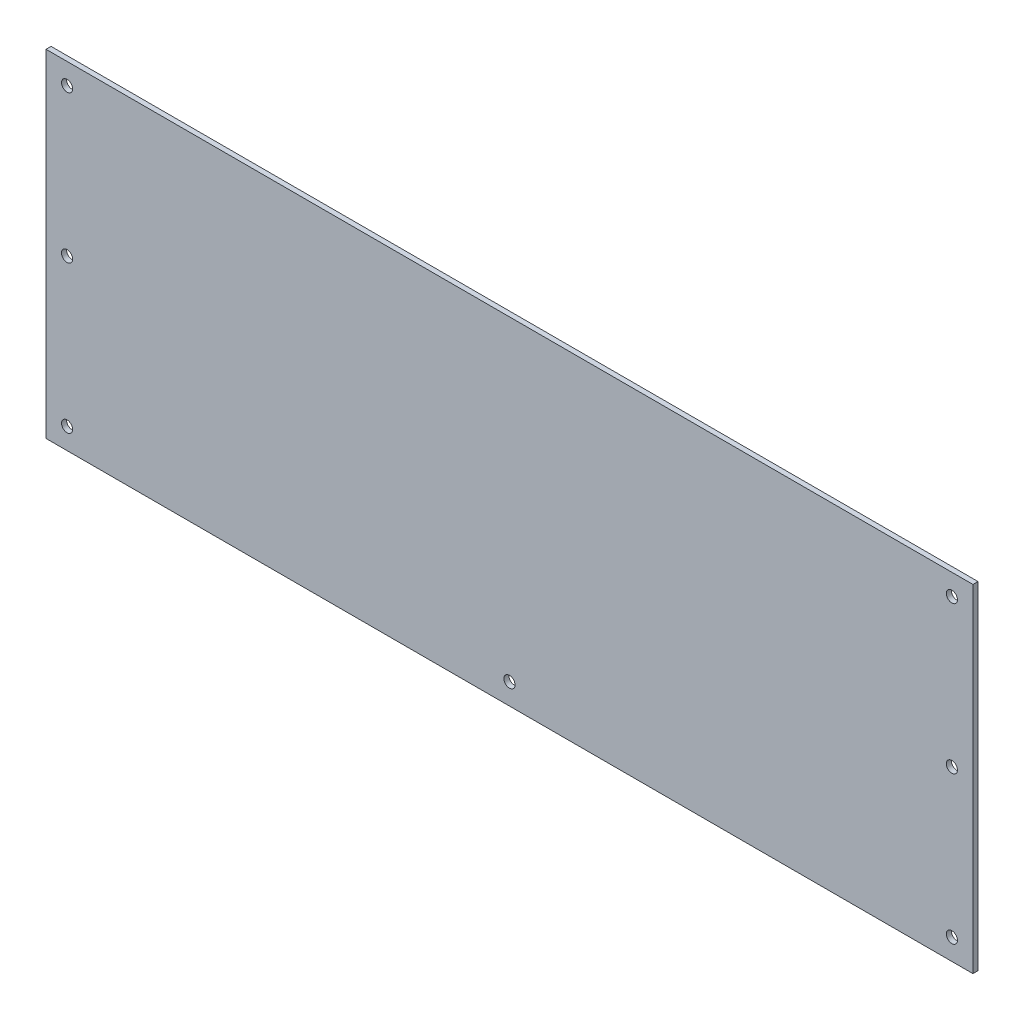
ISO-10303-21;
HEADER;
FILE_DESCRIPTION(('STEP AP214'),'2;1');
FILE_NAME('part.step','',(''),(''),'','','');
FILE_SCHEMA(('AUTOMOTIVE_DESIGN { 1 0 10303 214 1 1 1 1 }'));
ENDSEC;
DATA;
#1=APPLICATION_CONTEXT('core data for automotive mechanical design processes');
#2=APPLICATION_PROTOCOL_DEFINITION('international standard','automotive_design',2000,#1);
#3=PRODUCT_CONTEXT('',#1,'mechanical');
#4=PRODUCT('Part','Part','',(#3));
#5=PRODUCT_RELATED_PRODUCT_CATEGORY('part','',(#4));
#6=PRODUCT_DEFINITION_FORMATION('','',#4);
#7=PRODUCT_DEFINITION_CONTEXT('part definition',#1,'design');
#8=PRODUCT_DEFINITION('design','',#6,#7);
#9=PRODUCT_DEFINITION_SHAPE('','',#8);
#10=(LENGTH_UNIT() NAMED_UNIT(*) SI_UNIT(.MILLI.,.METRE.));
#11=(NAMED_UNIT(*) PLANE_ANGLE_UNIT() SI_UNIT($,.RADIAN.));
#12=(NAMED_UNIT(*) SI_UNIT($,.STERADIAN.) SOLID_ANGLE_UNIT());
#13=UNCERTAINTY_MEASURE_WITH_UNIT(LENGTH_MEASURE(1.E-05),#10,'distance_accuracy_value','');
#14=(GEOMETRIC_REPRESENTATION_CONTEXT(3) GLOBAL_UNCERTAINTY_ASSIGNED_CONTEXT((#13)) GLOBAL_UNIT_ASSIGNED_CONTEXT((#10,
#11,#12)) REPRESENTATION_CONTEXT('',''));
#15=CARTESIAN_POINT('',(0.,0.,0.));
#16=DIRECTION('',(0.,0.,1.));
#17=DIRECTION('',(1.,0.,0.));
#18=AXIS2_PLACEMENT_3D('',#15,#16,#17);
#19=CARTESIAN_POINT('',(0.,0.,0.));
#20=DIRECTION('',(0.,0.,-1.));
#21=DIRECTION('',(-1.,0.,0.));
#22=AXIS2_PLACEMENT_3D('',#19,#20,#21);
#23=PLANE('',#22);
#24=CARTESIAN_POINT('',(12.5,100.,0.));
#25=DIRECTION('',(0.,0.,1.));
#26=DIRECTION('',(1.,0.,0.));
#27=AXIS2_PLACEMENT_3D('',#24,#25,#26);
#28=CIRCLE('',#27,3.3);
#29=CARTESIAN_POINT('',(15.8,100.,0.));
#30=VERTEX_POINT('',#29);
#31=EDGE_CURVE('E145',#30,#30,#28,.T.);
#32=ORIENTED_EDGE('',*,*,#31,.T.);
#33=EDGE_LOOP('',(#32));
#34=FACE_BOUND('',#33,.T.);
#35=CARTESIAN_POINT('',(12.5,187.5,0.));
#36=DIRECTION('',(0.,0.,1.));
#37=DIRECTION('',(1.,0.,0.));
#38=AXIS2_PLACEMENT_3D('',#35,#36,#37);
#39=CIRCLE('',#38,3.3);
#40=CARTESIAN_POINT('',(15.8,187.5,0.));
#41=VERTEX_POINT('',#40);
#42=EDGE_CURVE('E139',#41,#41,#39,.T.);
#43=ORIENTED_EDGE('',*,*,#42,.T.);
#44=EDGE_LOOP('',(#43));
#45=FACE_BOUND('',#44,.T.);
#46=CARTESIAN_POINT('',(12.5,12.5,0.));
#47=DIRECTION('',(0.,0.,1.));
#48=DIRECTION('',(1.,0.,0.));
#49=AXIS2_PLACEMENT_3D('',#46,#47,#48);
#50=CIRCLE('',#49,3.3);
#51=CARTESIAN_POINT('',(15.8,12.5,0.));
#52=VERTEX_POINT('',#51);
#53=EDGE_CURVE('E133',#52,#52,#50,.T.);
#54=ORIENTED_EDGE('',*,*,#53,.T.);
#55=EDGE_LOOP('',(#54));
#56=FACE_BOUND('',#55,.T.);
#57=CARTESIAN_POINT('',(275.000000000004,12.5,0.));
#58=DIRECTION('',(0.,0.,1.));
#59=DIRECTION('',(1.,0.,0.));
#60=AXIS2_PLACEMENT_3D('',#57,#58,#59);
#61=CIRCLE('',#60,3.30000000000003);
#62=CARTESIAN_POINT('',(278.300000000005,12.5,0.));
#63=VERTEX_POINT('',#62);
#64=EDGE_CURVE('E127',#63,#63,#61,.T.);
#65=ORIENTED_EDGE('',*,*,#64,.T.);
#66=EDGE_LOOP('',(#65));
#67=FACE_BOUND('',#66,.T.);
#68=CARTESIAN_POINT('',(537.500000000009,12.5,0.));
#69=DIRECTION('',(0.,0.,1.));
#70=DIRECTION('',(1.,0.,0.));
#71=AXIS2_PLACEMENT_3D('',#68,#69,#70);
#72=CIRCLE('',#71,3.29999999999997);
#73=CARTESIAN_POINT('',(540.800000000009,12.5,0.));
#74=VERTEX_POINT('',#73);
#75=EDGE_CURVE('E121',#74,#74,#72,.T.);
#76=ORIENTED_EDGE('',*,*,#75,.T.);
#77=EDGE_LOOP('',(#76));
#78=FACE_BOUND('',#77,.T.);
#79=DIRECTION('',(0.,-1.,0.));
#80=VECTOR('',#79,1.);
#81=CARTESIAN_POINT('',(0.,0.,0.));
#82=LINE('',#81,#80);
#83=CARTESIAN_POINT('',(0.,200.,0.));
#84=VERTEX_POINT('',#83);
#85=CARTESIAN_POINT('',(0.,0.,0.));
#86=VERTEX_POINT('',#85);
#87=EDGE_CURVE('E96',#84,#86,#82,.T.);
#88=ORIENTED_EDGE('',*,*,#87,.F.);
#89=DIRECTION('',(-1.,0.,0.));
#90=VECTOR('',#89,1.);
#91=CARTESIAN_POINT('',(0.,200.,0.));
#92=LINE('',#91,#90);
#93=CARTESIAN_POINT('',(550.000000000009,200.,0.));
#94=VERTEX_POINT('',#93);
#95=EDGE_CURVE('E72',#94,#84,#92,.T.);
#96=ORIENTED_EDGE('',*,*,#95,.F.);
#97=DIRECTION('',(0.,1.,0.));
#98=VECTOR('',#97,1.);
#99=CARTESIAN_POINT('',(550.000000000009,0.,0.));
#100=LINE('',#99,#98);
#101=CARTESIAN_POINT('',(550.000000000009,0.,0.));
#102=VERTEX_POINT('',#101);
#103=EDGE_CURVE('E66',#102,#94,#100,.T.);
#104=ORIENTED_EDGE('',*,*,#103,.F.);
#105=DIRECTION('',(1.,0.,0.));
#106=VECTOR('',#105,1.);
#107=CARTESIAN_POINT('',(0.,0.,0.));
#108=LINE('',#107,#106);
#109=EDGE_CURVE('E88',#86,#102,#108,.T.);
#110=ORIENTED_EDGE('',*,*,#109,.F.);
#111=EDGE_LOOP('',(#88,#96,#104,#110));
#112=FACE_BOUND('',#111,.T.);
#113=CARTESIAN_POINT('',(537.500000000009,187.5,0.));
#114=DIRECTION('',(0.,0.,1.));
#115=DIRECTION('',(1.,0.,0.));
#116=AXIS2_PLACEMENT_3D('',#113,#114,#115);
#117=CIRCLE('',#116,3.29999999999997);
#118=CARTESIAN_POINT('',(540.800000000009,187.5,0.));
#119=VERTEX_POINT('',#118);
#120=EDGE_CURVE('E99',#119,#119,#117,.T.);
#121=ORIENTED_EDGE('',*,*,#120,.T.);
#122=EDGE_LOOP('',(#121));
#123=FACE_BOUND('',#122,.T.);
#124=CARTESIAN_POINT('',(537.500000000009,100.,0.));
#125=DIRECTION('',(0.,0.,1.));
#126=DIRECTION('',(1.,0.,0.));
#127=AXIS2_PLACEMENT_3D('',#124,#125,#126);
#128=CIRCLE('',#127,3.29999999999997);
#129=CARTESIAN_POINT('',(540.800000000009,100.,0.));
#130=VERTEX_POINT('',#129);
#131=EDGE_CURVE('E115',#130,#130,#128,.T.);
#132=ORIENTED_EDGE('',*,*,#131,.T.);
#133=EDGE_LOOP('',(#132));
#134=FACE_BOUND('',#133,.T.);
#135=ADVANCED_FACE('F32',(#34,#45,#56,#67,#78,#112,#123,#134),#23,.T.);
#136=CARTESIAN_POINT('',(0.,0.,3.));
#137=DIRECTION('',(1.,0.,0.));
#138=DIRECTION('',(0.,0.,-1.));
#139=AXIS2_PLACEMENT_3D('',#136,#137,#138);
#140=PLANE('',#139);
#141=ORIENTED_EDGE('',*,*,#87,.T.);
#142=DIRECTION('',(0.,0.,-1.));
#143=VECTOR('',#142,1.);
#144=CARTESIAN_POINT('',(0.,0.,3.));
#145=LINE('',#144,#143);
#146=CARTESIAN_POINT('',(0.,0.,3.));
#147=VERTEX_POINT('',#146);
#148=EDGE_CURVE('E11',#147,#86,#145,.T.);
#149=ORIENTED_EDGE('',*,*,#148,.F.);
#150=DIRECTION('',(0.,-1.,0.));
#151=VECTOR('',#150,1.);
#152=CARTESIAN_POINT('',(0.,0.,3.));
#153=LINE('',#152,#151);
#154=CARTESIAN_POINT('',(0.,200.,3.));
#155=VERTEX_POINT('',#154);
#156=EDGE_CURVE('E84',#155,#147,#153,.T.);
#157=ORIENTED_EDGE('',*,*,#156,.F.);
#158=DIRECTION('',(0.,0.,-1.));
#159=VECTOR('',#158,1.);
#160=CARTESIAN_POINT('',(0.,200.,3.));
#161=LINE('',#160,#159);
#162=EDGE_CURVE('E92',#155,#84,#161,.T.);
#163=ORIENTED_EDGE('',*,*,#162,.T.);
#164=EDGE_LOOP('',(#141,#149,#157,#163));
#165=FACE_BOUND('',#164,.T.);
#166=ADVANCED_FACE('F34',(#165),#140,.F.);
#167=CARTESIAN_POINT('',(0.,0.,3.));
#168=DIRECTION('',(0.,1.,0.));
#169=DIRECTION('',(0.,0.,1.));
#170=AXIS2_PLACEMENT_3D('',#167,#168,#169);
#171=PLANE('',#170);
#172=ORIENTED_EDGE('',*,*,#109,.T.);
#173=DIRECTION('',(0.,0.,-1.));
#174=VECTOR('',#173,1.);
#175=CARTESIAN_POINT('',(550.000000000009,0.,3.));
#176=LINE('',#175,#174);
#177=CARTESIAN_POINT('',(550.000000000009,0.,3.));
#178=VERTEX_POINT('',#177);
#179=EDGE_CURVE('E41',#178,#102,#176,.T.);
#180=ORIENTED_EDGE('',*,*,#179,.F.);
#181=DIRECTION('',(1.,0.,0.));
#182=VECTOR('',#181,1.);
#183=CARTESIAN_POINT('',(0.,0.,3.));
#184=LINE('',#183,#182);
#185=EDGE_CURVE('E79',#147,#178,#184,.T.);
#186=ORIENTED_EDGE('',*,*,#185,.F.);
#187=ORIENTED_EDGE('',*,*,#148,.T.);
#188=EDGE_LOOP('',(#172,#180,#186,#187));
#189=FACE_BOUND('',#188,.T.);
#190=ADVANCED_FACE('F87',(#189),#171,.F.);
#191=CARTESIAN_POINT('',(550.000000000009,0.,3.));
#192=DIRECTION('',(-1.,0.,0.));
#193=DIRECTION('',(0.,0.,1.));
#194=AXIS2_PLACEMENT_3D('',#191,#192,#193);
#195=PLANE('',#194);
#196=ORIENTED_EDGE('',*,*,#103,.T.);
#197=DIRECTION('',(0.,0.,-1.));
#198=VECTOR('',#197,1.);
#199=CARTESIAN_POINT('',(550.000000000009,200.,3.));
#200=LINE('',#199,#198);
#201=CARTESIAN_POINT('',(550.000000000009,200.,3.));
#202=VERTEX_POINT('',#201);
#203=EDGE_CURVE('E89',#202,#94,#200,.T.);
#204=ORIENTED_EDGE('',*,*,#203,.F.);
#205=DIRECTION('',(0.,1.,0.));
#206=VECTOR('',#205,1.);
#207=CARTESIAN_POINT('',(550.000000000009,0.,3.));
#208=LINE('',#207,#206);
#209=EDGE_CURVE('E82',#178,#202,#208,.T.);
#210=ORIENTED_EDGE('',*,*,#209,.F.);
#211=ORIENTED_EDGE('',*,*,#179,.T.);
#212=EDGE_LOOP('',(#196,#204,#210,#211));
#213=FACE_BOUND('',#212,.T.);
#214=ADVANCED_FACE('F90',(#213),#195,.F.);
#215=CARTESIAN_POINT('',(0.,200.,3.));
#216=DIRECTION('',(0.,-1.,0.));
#217=DIRECTION('',(0.,0.,-1.));
#218=AXIS2_PLACEMENT_3D('',#215,#216,#217);
#219=PLANE('',#218);
#220=ORIENTED_EDGE('',*,*,#95,.T.);
#221=ORIENTED_EDGE('',*,*,#162,.F.);
#222=DIRECTION('',(-1.,0.,0.));
#223=VECTOR('',#222,1.);
#224=CARTESIAN_POINT('',(0.,200.,3.));
#225=LINE('',#224,#223);
#226=EDGE_CURVE('E49',#202,#155,#225,.T.);
#227=ORIENTED_EDGE('',*,*,#226,.F.);
#228=ORIENTED_EDGE('',*,*,#203,.T.);
#229=EDGE_LOOP('',(#220,#221,#227,#228));
#230=FACE_BOUND('',#229,.T.);
#231=ADVANCED_FACE('F104',(#230),#219,.F.);
#232=CARTESIAN_POINT('',(0.,0.,3.));
#233=DIRECTION('',(0.,0.,-1.));
#234=DIRECTION('',(-1.,0.,0.));
#235=AXIS2_PLACEMENT_3D('',#232,#233,#234);
#236=PLANE('',#235);
#237=CARTESIAN_POINT('',(12.5,100.,3.));
#238=DIRECTION('',(0.,0.,1.));
#239=DIRECTION('',(1.,0.,0.));
#240=AXIS2_PLACEMENT_3D('',#237,#238,#239);
#241=CIRCLE('',#240,3.3);
#242=CARTESIAN_POINT('',(15.8,100.,3.));
#243=VERTEX_POINT('',#242);
#244=EDGE_CURVE('E148',#243,#243,#241,.T.);
#245=ORIENTED_EDGE('',*,*,#244,.F.);
#246=EDGE_LOOP('',(#245));
#247=FACE_BOUND('',#246,.T.);
#248=CARTESIAN_POINT('',(12.5,187.5,3.));
#249=DIRECTION('',(0.,0.,1.));
#250=DIRECTION('',(1.,0.,0.));
#251=AXIS2_PLACEMENT_3D('',#248,#249,#250);
#252=CIRCLE('',#251,3.3);
#253=CARTESIAN_POINT('',(15.8,187.5,3.));
#254=VERTEX_POINT('',#253);
#255=EDGE_CURVE('E142',#254,#254,#252,.T.);
#256=ORIENTED_EDGE('',*,*,#255,.F.);
#257=EDGE_LOOP('',(#256));
#258=FACE_BOUND('',#257,.T.);
#259=CARTESIAN_POINT('',(12.5,12.5,3.));
#260=DIRECTION('',(0.,0.,1.));
#261=DIRECTION('',(1.,0.,0.));
#262=AXIS2_PLACEMENT_3D('',#259,#260,#261);
#263=CIRCLE('',#262,3.3);
#264=CARTESIAN_POINT('',(15.8,12.5,3.));
#265=VERTEX_POINT('',#264);
#266=EDGE_CURVE('E136',#265,#265,#263,.T.);
#267=ORIENTED_EDGE('',*,*,#266,.F.);
#268=EDGE_LOOP('',(#267));
#269=FACE_BOUND('',#268,.T.);
#270=CARTESIAN_POINT('',(275.000000000004,12.5,3.));
#271=DIRECTION('',(0.,0.,1.));
#272=DIRECTION('',(1.,0.,0.));
#273=AXIS2_PLACEMENT_3D('',#270,#271,#272);
#274=CIRCLE('',#273,3.30000000000003);
#275=CARTESIAN_POINT('',(278.300000000005,12.5,3.));
#276=VERTEX_POINT('',#275);
#277=EDGE_CURVE('E130',#276,#276,#274,.T.);
#278=ORIENTED_EDGE('',*,*,#277,.F.);
#279=EDGE_LOOP('',(#278));
#280=FACE_BOUND('',#279,.T.);
#281=CARTESIAN_POINT('',(537.500000000009,12.5,3.));
#282=DIRECTION('',(0.,0.,1.));
#283=DIRECTION('',(1.,0.,0.));
#284=AXIS2_PLACEMENT_3D('',#281,#282,#283);
#285=CIRCLE('',#284,3.29999999999997);
#286=CARTESIAN_POINT('',(540.800000000009,12.5,3.));
#287=VERTEX_POINT('',#286);
#288=EDGE_CURVE('E124',#287,#287,#285,.T.);
#289=ORIENTED_EDGE('',*,*,#288,.F.);
#290=EDGE_LOOP('',(#289));
#291=FACE_BOUND('',#290,.T.);
#292=CARTESIAN_POINT('',(537.500000000009,100.,3.));
#293=DIRECTION('',(0.,0.,1.));
#294=DIRECTION('',(1.,0.,0.));
#295=AXIS2_PLACEMENT_3D('',#292,#293,#294);
#296=CIRCLE('',#295,3.29999999999997);
#297=CARTESIAN_POINT('',(540.800000000009,100.,3.));
#298=VERTEX_POINT('',#297);
#299=EDGE_CURVE('E118',#298,#298,#296,.T.);
#300=ORIENTED_EDGE('',*,*,#299,.F.);
#301=EDGE_LOOP('',(#300));
#302=FACE_BOUND('',#301,.T.);
#303=CARTESIAN_POINT('',(537.500000000009,187.5,3.));
#304=DIRECTION('',(0.,0.,1.));
#305=DIRECTION('',(1.,0.,0.));
#306=AXIS2_PLACEMENT_3D('',#303,#304,#305);
#307=CIRCLE('',#306,3.29999999999997);
#308=CARTESIAN_POINT('',(540.800000000009,187.5,3.));
#309=VERTEX_POINT('',#308);
#310=EDGE_CURVE('E112',#309,#309,#307,.T.);
#311=ORIENTED_EDGE('',*,*,#310,.F.);
#312=EDGE_LOOP('',(#311));
#313=FACE_BOUND('',#312,.T.);
#314=ORIENTED_EDGE('',*,*,#156,.T.);
#315=ORIENTED_EDGE('',*,*,#185,.T.);
#316=ORIENTED_EDGE('',*,*,#209,.T.);
#317=ORIENTED_EDGE('',*,*,#226,.T.);
#318=EDGE_LOOP('',(#314,#315,#316,#317));
#319=FACE_BOUND('',#318,.T.);
#320=ADVANCED_FACE('F80',(#247,#258,#269,#280,#291,#302,#313,#319),#236,.F.);
#321=CARTESIAN_POINT('',(537.500000000009,187.5,3.));
#322=DIRECTION('',(0.,0.,1.));
#323=DIRECTION('',(1.,0.,0.));
#324=AXIS2_PLACEMENT_3D('',#321,#322,#323);
#325=CYLINDRICAL_SURFACE('',#324,3.29999999999997);
#326=ORIENTED_EDGE('',*,*,#120,.F.);
#327=EDGE_LOOP('',(#326));
#328=FACE_BOUND('',#327,.T.);
#329=ORIENTED_EDGE('',*,*,#310,.T.);
#330=EDGE_LOOP('',(#329));
#331=FACE_BOUND('',#330,.T.);
#332=ADVANCED_FACE('F156',(#328,#331),#325,.F.);
#333=CARTESIAN_POINT('',(537.500000000009,100.,3.));
#334=DIRECTION('',(0.,0.,1.));
#335=DIRECTION('',(1.,0.,0.));
#336=AXIS2_PLACEMENT_3D('',#333,#334,#335);
#337=CYLINDRICAL_SURFACE('',#336,3.29999999999997);
#338=ORIENTED_EDGE('',*,*,#131,.F.);
#339=EDGE_LOOP('',(#338));
#340=FACE_BOUND('',#339,.T.);
#341=ORIENTED_EDGE('',*,*,#299,.T.);
#342=EDGE_LOOP('',(#341));
#343=FACE_BOUND('',#342,.T.);
#344=ADVANCED_FACE('F171',(#340,#343),#337,.F.);
#345=CARTESIAN_POINT('',(537.500000000009,12.5,3.));
#346=DIRECTION('',(0.,0.,1.));
#347=DIRECTION('',(1.,0.,0.));
#348=AXIS2_PLACEMENT_3D('',#345,#346,#347);
#349=CYLINDRICAL_SURFACE('',#348,3.29999999999997);
#350=ORIENTED_EDGE('',*,*,#75,.F.);
#351=EDGE_LOOP('',(#350));
#352=FACE_BOUND('',#351,.T.);
#353=ORIENTED_EDGE('',*,*,#288,.T.);
#354=EDGE_LOOP('',(#353));
#355=FACE_BOUND('',#354,.T.);
#356=ADVANCED_FACE('F177',(#352,#355),#349,.F.);
#357=CARTESIAN_POINT('',(275.000000000004,12.5,3.));
#358=DIRECTION('',(0.,0.,1.));
#359=DIRECTION('',(1.,0.,0.));
#360=AXIS2_PLACEMENT_3D('',#357,#358,#359);
#361=CYLINDRICAL_SURFACE('',#360,3.30000000000003);
#362=ORIENTED_EDGE('',*,*,#64,.F.);
#363=EDGE_LOOP('',(#362));
#364=FACE_BOUND('',#363,.T.);
#365=ORIENTED_EDGE('',*,*,#277,.T.);
#366=EDGE_LOOP('',(#365));
#367=FACE_BOUND('',#366,.T.);
#368=ADVANCED_FACE('F230',(#364,#367),#361,.F.);
#369=CARTESIAN_POINT('',(12.5,12.5,3.));
#370=DIRECTION('',(0.,0.,1.));
#371=DIRECTION('',(1.,0.,0.));
#372=AXIS2_PLACEMENT_3D('',#369,#370,#371);
#373=CYLINDRICAL_SURFACE('',#372,3.3);
#374=ORIENTED_EDGE('',*,*,#53,.F.);
#375=EDGE_LOOP('',(#374));
#376=FACE_BOUND('',#375,.T.);
#377=ORIENTED_EDGE('',*,*,#266,.T.);
#378=EDGE_LOOP('',(#377));
#379=FACE_BOUND('',#378,.T.);
#380=ADVANCED_FACE('F240',(#376,#379),#373,.F.);
#381=CARTESIAN_POINT('',(12.5,187.5,3.));
#382=DIRECTION('',(0.,0.,1.));
#383=DIRECTION('',(1.,0.,0.));
#384=AXIS2_PLACEMENT_3D('',#381,#382,#383);
#385=CYLINDRICAL_SURFACE('',#384,3.3);
#386=ORIENTED_EDGE('',*,*,#42,.F.);
#387=EDGE_LOOP('',(#386));
#388=FACE_BOUND('',#387,.T.);
#389=ORIENTED_EDGE('',*,*,#255,.T.);
#390=EDGE_LOOP('',(#389));
#391=FACE_BOUND('',#390,.T.);
#392=ADVANCED_FACE('F250',(#388,#391),#385,.F.);
#393=CARTESIAN_POINT('',(12.5,100.,3.));
#394=DIRECTION('',(0.,0.,1.));
#395=DIRECTION('',(1.,0.,0.));
#396=AXIS2_PLACEMENT_3D('',#393,#394,#395);
#397=CYLINDRICAL_SURFACE('',#396,3.3);
#398=ORIENTED_EDGE('',*,*,#31,.F.);
#399=EDGE_LOOP('',(#398));
#400=FACE_BOUND('',#399,.T.);
#401=ORIENTED_EDGE('',*,*,#244,.T.);
#402=EDGE_LOOP('',(#401));
#403=FACE_BOUND('',#402,.T.);
#404=ADVANCED_FACE('F152',(#400,#403),#397,.F.);
#405=CLOSED_SHELL('',(#135,#166,#190,#214,#231,#320,#332,#344,#356,#368,#380,#392,#404));
#406=MANIFOLD_SOLID_BREP('B2',#405);
#407=ADVANCED_BREP_SHAPE_REPRESENTATION('',(#18,#406),#14);
#408=SHAPE_DEFINITION_REPRESENTATION(#9,#407);
ENDSEC;
END-ISO-10303-21;
